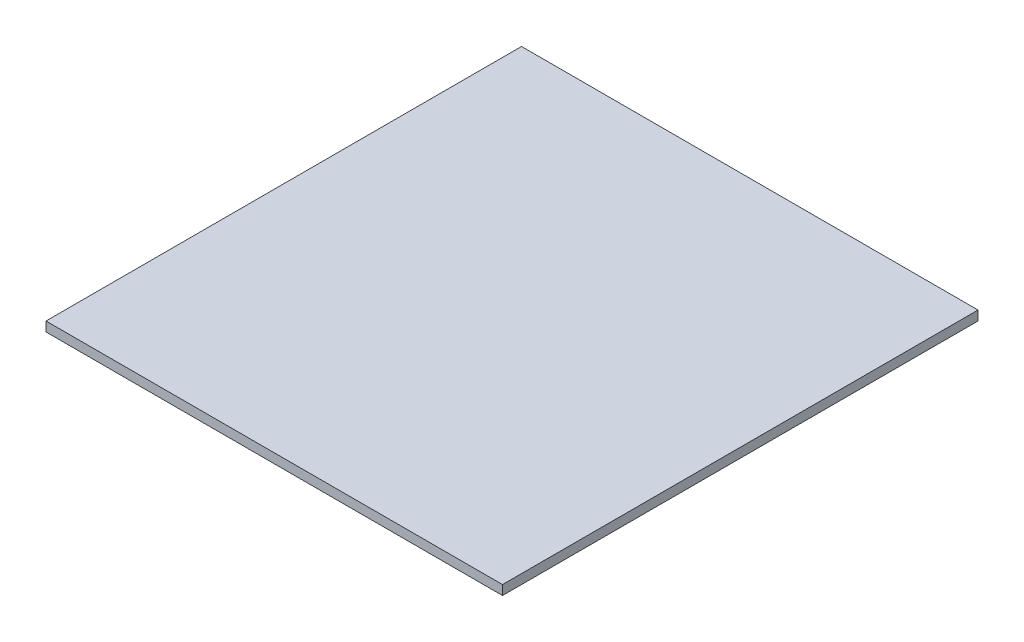
ISO-10303-21;
HEADER;
FILE_DESCRIPTION(('STEP AP214'),'2;1');
FILE_NAME('part.step','',(''),(''),'','','');
FILE_SCHEMA(('AUTOMOTIVE_DESIGN { 1 0 10303 214 1 1 1 1 }'));
ENDSEC;
DATA;
#1=APPLICATION_CONTEXT('core data for automotive mechanical design processes');
#2=APPLICATION_PROTOCOL_DEFINITION('international standard','automotive_design',2000,#1);
#3=PRODUCT_CONTEXT('',#1,'mechanical');
#4=PRODUCT('Part','Part','',(#3));
#5=PRODUCT_RELATED_PRODUCT_CATEGORY('part','',(#4));
#6=PRODUCT_DEFINITION_FORMATION('','',#4);
#7=PRODUCT_DEFINITION_CONTEXT('part definition',#1,'design');
#8=PRODUCT_DEFINITION('design','',#6,#7);
#9=PRODUCT_DEFINITION_SHAPE('','',#8);
#10=(LENGTH_UNIT() NAMED_UNIT(*) SI_UNIT(.MILLI.,.METRE.));
#11=(NAMED_UNIT(*) PLANE_ANGLE_UNIT() SI_UNIT($,.RADIAN.));
#12=(NAMED_UNIT(*) SI_UNIT($,.STERADIAN.) SOLID_ANGLE_UNIT());
#13=UNCERTAINTY_MEASURE_WITH_UNIT(LENGTH_MEASURE(1.E-05),#10,'distance_accuracy_value','');
#14=(GEOMETRIC_REPRESENTATION_CONTEXT(3) GLOBAL_UNCERTAINTY_ASSIGNED_CONTEXT((#13)) GLOBAL_UNIT_ASSIGNED_CONTEXT((#10,
#11,#12)) REPRESENTATION_CONTEXT('',''));
#15=CARTESIAN_POINT('',(0.,0.,0.));
#16=DIRECTION('',(0.,0.,1.));
#17=DIRECTION('',(1.,0.,0.));
#18=AXIS2_PLACEMENT_3D('',#15,#16,#17);
#19=CARTESIAN_POINT('',(0.,0.5,0.));
#20=DIRECTION('',(0.,1.,0.));
#21=DIRECTION('',(-1.,0.,0.));
#22=AXIS2_PLACEMENT_3D('',#19,#20,#21);
#23=PLANE('',#22);
#24=DIRECTION('',(0.,0.,-1.));
#25=VECTOR('',#24,1.);
#26=CARTESIAN_POINT('',(0.6,0.5,-0.625));
#27=LINE('',#26,#25);
#28=CARTESIAN_POINT('',(0.6,0.5,-0.625));
#29=VERTEX_POINT('',#28);
#30=CARTESIAN_POINT('',(0.6,0.5,0.625));
#31=VERTEX_POINT('',#30);
#32=EDGE_CURVE('E58',#29,#31,#27,.F.);
#33=ORIENTED_EDGE('',*,*,#32,.F.);
#34=DIRECTION('',(-1.,0.,0.));
#35=VECTOR('',#34,1.);
#36=CARTESIAN_POINT('',(-0.6,0.5,-0.625));
#37=LINE('',#36,#35);
#38=CARTESIAN_POINT('',(-0.6,0.5,-0.625));
#39=VERTEX_POINT('',#38);
#40=EDGE_CURVE('E53',#39,#29,#37,.F.);
#41=ORIENTED_EDGE('',*,*,#40,.F.);
#42=DIRECTION('',(0.,0.,1.));
#43=VECTOR('',#42,1.);
#44=CARTESIAN_POINT('',(-0.6,0.5,-0.625));
#45=LINE('',#44,#43);
#46=CARTESIAN_POINT('',(-0.6,0.5,0.625));
#47=VERTEX_POINT('',#46);
#48=EDGE_CURVE('E68',#47,#39,#45,.F.);
#49=ORIENTED_EDGE('',*,*,#48,.F.);
#50=DIRECTION('',(1.,0.,0.));
#51=VECTOR('',#50,1.);
#52=CARTESIAN_POINT('',(-0.6,0.5,0.625));
#53=LINE('',#52,#51);
#54=EDGE_CURVE('E20',#31,#47,#53,.F.);
#55=ORIENTED_EDGE('',*,*,#54,.F.);
#56=EDGE_LOOP('',(#33,#41,#49,#55));
#57=FACE_BOUND('',#56,.T.);
#58=ADVANCED_FACE('F17',(#57),#23,.T.);
#59=CARTESIAN_POINT('',(-0.6,-1.257772345116,0.625));
#60=DIRECTION('',(0.,0.,1.));
#61=DIRECTION('',(1.,0.,0.));
#62=AXIS2_PLACEMENT_3D('',#59,#60,#61);
#63=PLANE('',#62);
#64=ORIENTED_EDGE('',*,*,#54,.T.);
#65=DIRECTION('',(0.,1.,0.));
#66=VECTOR('',#65,1.);
#67=CARTESIAN_POINT('',(-0.6,-1.257772345116,0.625));
#68=LINE('',#67,#66);
#69=CARTESIAN_POINT('',(-0.6,0.475,0.625));
#70=VERTEX_POINT('',#69);
#71=EDGE_CURVE('E79',#70,#47,#68,.T.);
#72=ORIENTED_EDGE('',*,*,#71,.F.);
#73=DIRECTION('',(1.,0.,0.));
#74=VECTOR('',#73,1.);
#75=CARTESIAN_POINT('',(-0.975,0.475,0.625));
#76=LINE('',#75,#74);
#77=CARTESIAN_POINT('',(0.6,0.475,0.625));
#78=VERTEX_POINT('',#77);
#79=EDGE_CURVE('E74',#70,#78,#76,.T.);
#80=ORIENTED_EDGE('',*,*,#79,.T.);
#81=DIRECTION('',(0.,1.,0.));
#82=VECTOR('',#81,1.);
#83=CARTESIAN_POINT('',(0.6,-1.257772345116,0.625));
#84=LINE('',#83,#82);
#85=EDGE_CURVE('E63',#31,#78,#84,.F.);
#86=ORIENTED_EDGE('',*,*,#85,.F.);
#87=EDGE_LOOP('',(#64,#72,#80,#86));
#88=FACE_BOUND('',#87,.T.);
#89=ADVANCED_FACE('F73',(#88),#63,.T.);
#90=CARTESIAN_POINT('',(0.6,-1.257772345116,-0.625));
#91=DIRECTION('',(1.,0.,0.));
#92=DIRECTION('',(0.,0.,-1.));
#93=AXIS2_PLACEMENT_3D('',#90,#91,#92);
#94=PLANE('',#93);
#95=ORIENTED_EDGE('',*,*,#32,.T.);
#96=ORIENTED_EDGE('',*,*,#85,.T.);
#97=DIRECTION('',(0.,0.,1.));
#98=VECTOR('',#97,1.);
#99=CARTESIAN_POINT('',(0.6,0.475,-2.626249609619));
#100=LINE('',#99,#98);
#101=CARTESIAN_POINT('',(0.6,0.475,-0.625));
#102=VERTEX_POINT('',#101);
#103=EDGE_CURVE('E84',#78,#102,#100,.F.);
#104=ORIENTED_EDGE('',*,*,#103,.T.);
#105=DIRECTION('',(0.,1.,0.));
#106=VECTOR('',#105,1.);
#107=CARTESIAN_POINT('',(0.6,-1.257772345116,-0.625));
#108=LINE('',#107,#106);
#109=EDGE_CURVE('E65',#29,#102,#108,.F.);
#110=ORIENTED_EDGE('',*,*,#109,.F.);
#111=EDGE_LOOP('',(#95,#96,#104,#110));
#112=FACE_BOUND('',#111,.T.);
#113=ADVANCED_FACE('F60',(#112),#94,.T.);
#114=CARTESIAN_POINT('',(-0.6,-1.257772345116,-0.625));
#115=DIRECTION('',(0.,0.,-1.));
#116=DIRECTION('',(-1.,0.,0.));
#117=AXIS2_PLACEMENT_3D('',#114,#115,#116);
#118=PLANE('',#117);
#119=ORIENTED_EDGE('',*,*,#40,.T.);
#120=ORIENTED_EDGE('',*,*,#109,.T.);
#121=DIRECTION('',(1.,0.,0.));
#122=VECTOR('',#121,1.);
#123=CARTESIAN_POINT('',(-0.975,0.475,-0.625));
#124=LINE('',#123,#122);
#125=CARTESIAN_POINT('',(-0.6,0.475,-0.625));
#126=VERTEX_POINT('',#125);
#127=EDGE_CURVE('E26',#102,#126,#124,.F.);
#128=ORIENTED_EDGE('',*,*,#127,.T.);
#129=DIRECTION('',(0.,1.,0.));
#130=VECTOR('',#129,1.);
#131=CARTESIAN_POINT('',(-0.6,-1.257772345116,-0.625));
#132=LINE('',#131,#130);
#133=EDGE_CURVE('E34',#39,#126,#132,.F.);
#134=ORIENTED_EDGE('',*,*,#133,.F.);
#135=EDGE_LOOP('',(#119,#120,#128,#134));
#136=FACE_BOUND('',#135,.T.);
#137=ADVANCED_FACE('F88',(#136),#118,.T.);
#138=CARTESIAN_POINT('',(-0.6,-1.257772345116,-0.625));
#139=DIRECTION('',(-1.,0.,0.));
#140=DIRECTION('',(0.,0.,1.));
#141=AXIS2_PLACEMENT_3D('',#138,#139,#140);
#142=PLANE('',#141);
#143=ORIENTED_EDGE('',*,*,#48,.T.);
#144=ORIENTED_EDGE('',*,*,#133,.T.);
#145=DIRECTION('',(0.,0.,1.));
#146=VECTOR('',#145,1.);
#147=CARTESIAN_POINT('',(-0.6,0.475,-2.626249609619));
#148=LINE('',#147,#146);
#149=EDGE_CURVE('E11',#126,#70,#148,.T.);
#150=ORIENTED_EDGE('',*,*,#149,.T.);
#151=ORIENTED_EDGE('',*,*,#71,.T.);
#152=EDGE_LOOP('',(#143,#144,#150,#151));
#153=FACE_BOUND('',#152,.T.);
#154=ADVANCED_FACE('F91',(#153),#142,.T.);
#155=CARTESIAN_POINT('',(-0.975,0.475,-2.626249609619));
#156=DIRECTION('',(0.,1.,0.));
#157=DIRECTION('',(0.,0.,1.));
#158=AXIS2_PLACEMENT_3D('',#155,#156,#157);
#159=PLANE('',#158);
#160=ORIENTED_EDGE('',*,*,#127,.F.);
#161=ORIENTED_EDGE('',*,*,#103,.F.);
#162=ORIENTED_EDGE('',*,*,#79,.F.);
#163=ORIENTED_EDGE('',*,*,#149,.F.);
#164=EDGE_LOOP('',(#160,#161,#162,#163));
#165=FACE_BOUND('',#164,.T.);
#166=ADVANCED_FACE('F90',(#165),#159,.F.);
#167=CLOSED_SHELL('',(#58,#89,#113,#137,#154,#166));
#168=MANIFOLD_SOLID_BREP('B1',#167);
#169=ADVANCED_BREP_SHAPE_REPRESENTATION('',(#18,#168),#14);
#170=SHAPE_DEFINITION_REPRESENTATION(#9,#169);
ENDSEC;
END-ISO-10303-21;
